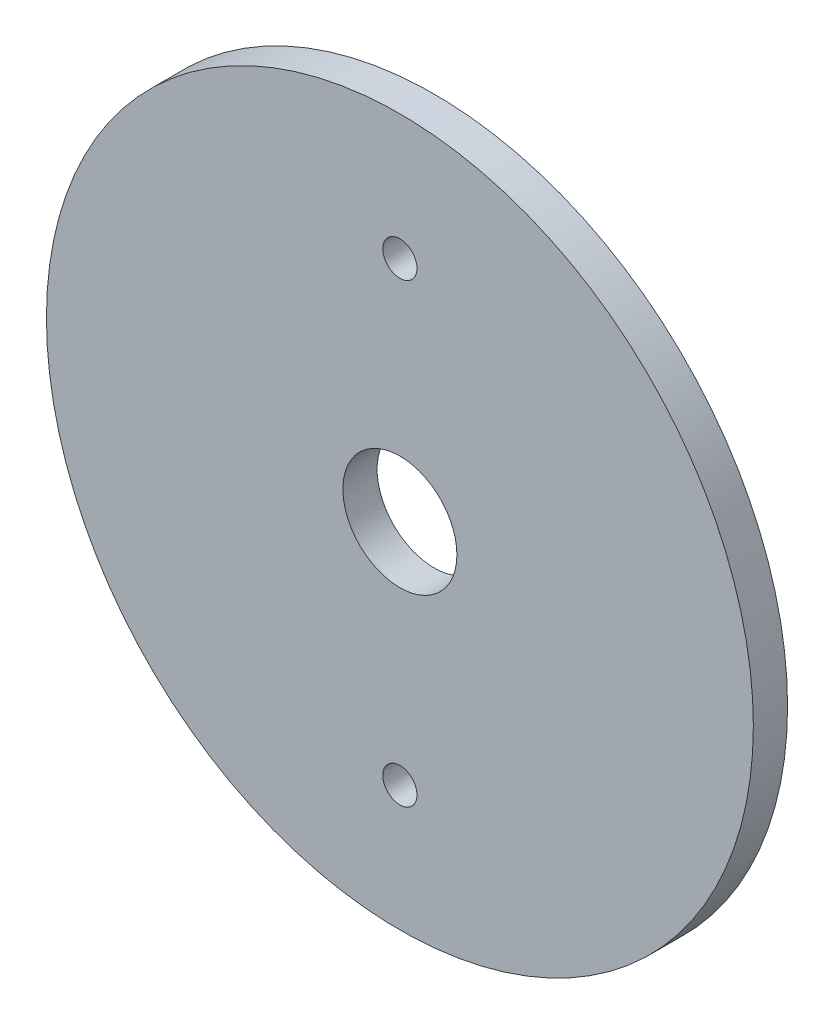
ISO-10303-21;
HEADER;
FILE_DESCRIPTION(('STEP AP214'),'2;1');
FILE_NAME('part.step','',(''),(''),'','','');
FILE_SCHEMA(('AUTOMOTIVE_DESIGN { 1 0 10303 214 1 1 1 1 }'));
ENDSEC;
DATA;
#1=APPLICATION_CONTEXT('core data for automotive mechanical design processes');
#2=APPLICATION_PROTOCOL_DEFINITION('international standard','automotive_design',2000,#1);
#3=PRODUCT_CONTEXT('',#1,'mechanical');
#4=PRODUCT('Part','Part','',(#3));
#5=PRODUCT_RELATED_PRODUCT_CATEGORY('part','',(#4));
#6=PRODUCT_DEFINITION_FORMATION('','',#4);
#7=PRODUCT_DEFINITION_CONTEXT('part definition',#1,'design');
#8=PRODUCT_DEFINITION('design','',#6,#7);
#9=PRODUCT_DEFINITION_SHAPE('','',#8);
#10=(LENGTH_UNIT() NAMED_UNIT(*) SI_UNIT(.MILLI.,.METRE.));
#11=(NAMED_UNIT(*) PLANE_ANGLE_UNIT() SI_UNIT($,.RADIAN.));
#12=(NAMED_UNIT(*) SI_UNIT($,.STERADIAN.) SOLID_ANGLE_UNIT());
#13=UNCERTAINTY_MEASURE_WITH_UNIT(LENGTH_MEASURE(1.E-05),#10,'distance_accuracy_value','');
#14=(GEOMETRIC_REPRESENTATION_CONTEXT(3) GLOBAL_UNCERTAINTY_ASSIGNED_CONTEXT((#13)) GLOBAL_UNIT_ASSIGNED_CONTEXT((#10,
#11,#12)) REPRESENTATION_CONTEXT('',''));
#15=CARTESIAN_POINT('',(0.,0.,0.));
#16=DIRECTION('',(0.,0.,1.));
#17=DIRECTION('',(1.,0.,0.));
#18=AXIS2_PLACEMENT_3D('',#15,#16,#17);
#19=CARTESIAN_POINT('',(0.,0.,0.));
#20=DIRECTION('',(0.,0.,1.));
#21=DIRECTION('',(1.,0.,0.));
#22=AXIS2_PLACEMENT_3D('',#19,#20,#21);
#23=PLANE('',#22);
#24=CARTESIAN_POINT('',(0.,20.,0.));
#25=DIRECTION('',(0.,0.,-1.));
#26=DIRECTION('',(1.,0.,0.));
#27=AXIS2_PLACEMENT_3D('',#24,#25,#26);
#28=CIRCLE('',#27,1.5);
#29=CARTESIAN_POINT('',(1.5,20.,0.));
#30=VERTEX_POINT('',#29);
#31=EDGE_CURVE('E32',#30,#30,#28,.T.);
#32=ORIENTED_EDGE('',*,*,#31,.F.);
#33=EDGE_LOOP('',(#32));
#34=FACE_BOUND('',#33,.T.);
#35=CARTESIAN_POINT('',(0.,-20.,0.));
#36=DIRECTION('',(0.,0.,-1.));
#37=DIRECTION('',(1.,0.,0.));
#38=AXIS2_PLACEMENT_3D('',#35,#36,#37);
#39=CIRCLE('',#38,1.5);
#40=CARTESIAN_POINT('',(1.5,-20.,0.));
#41=VERTEX_POINT('',#40);
#42=EDGE_CURVE('E46',#41,#41,#39,.T.);
#43=ORIENTED_EDGE('',*,*,#42,.F.);
#44=EDGE_LOOP('',(#43));
#45=FACE_BOUND('',#44,.T.);
#46=CARTESIAN_POINT('',(0.,0.,0.));
#47=DIRECTION('',(0.,0.,-1.));
#48=DIRECTION('',(1.,0.,0.));
#49=AXIS2_PLACEMENT_3D('',#46,#47,#48);
#50=CIRCLE('',#49,5.);
#51=CARTESIAN_POINT('',(5.,0.,0.));
#52=VERTEX_POINT('',#51);
#53=EDGE_CURVE('E37',#52,#52,#50,.T.);
#54=ORIENTED_EDGE('',*,*,#53,.F.);
#55=EDGE_LOOP('',(#54));
#56=FACE_BOUND('',#55,.T.);
#57=CARTESIAN_POINT('',(0.,0.,0.));
#58=DIRECTION('',(0.,0.,-1.));
#59=DIRECTION('',(1.,0.,0.));
#60=AXIS2_PLACEMENT_3D('',#57,#58,#59);
#61=CIRCLE('',#60,31.);
#62=CARTESIAN_POINT('',(31.,0.,0.));
#63=VERTEX_POINT('',#62);
#64=EDGE_CURVE('E10',#63,#63,#61,.T.);
#65=ORIENTED_EDGE('',*,*,#64,.T.);
#66=EDGE_LOOP('',(#65));
#67=FACE_BOUND('',#66,.T.);
#68=ADVANCED_FACE('F15',(#34,#45,#56,#67),#23,.F.);
#69=CARTESIAN_POINT('',(0.,0.,3.));
#70=DIRECTION('',(0.,0.,1.));
#71=DIRECTION('',(1.,0.,0.));
#72=AXIS2_PLACEMENT_3D('',#69,#70,#71);
#73=PLANE('',#72);
#74=CARTESIAN_POINT('',(0.,20.,3.));
#75=DIRECTION('',(0.,0.,-1.));
#76=DIRECTION('',(1.,0.,0.));
#77=AXIS2_PLACEMENT_3D('',#74,#75,#76);
#78=CIRCLE('',#77,1.5);
#79=CARTESIAN_POINT('',(1.5,20.,3.));
#80=VERTEX_POINT('',#79);
#81=EDGE_CURVE('E45',#80,#80,#78,.T.);
#82=ORIENTED_EDGE('',*,*,#81,.T.);
#83=EDGE_LOOP('',(#82));
#84=FACE_BOUND('',#83,.T.);
#85=CARTESIAN_POINT('',(0.,-20.,3.));
#86=DIRECTION('',(0.,0.,-1.));
#87=DIRECTION('',(1.,0.,0.));
#88=AXIS2_PLACEMENT_3D('',#85,#86,#87);
#89=CIRCLE('',#88,1.5);
#90=CARTESIAN_POINT('',(1.5,-20.,3.));
#91=VERTEX_POINT('',#90);
#92=EDGE_CURVE('E41',#91,#91,#89,.T.);
#93=ORIENTED_EDGE('',*,*,#92,.T.);
#94=EDGE_LOOP('',(#93));
#95=FACE_BOUND('',#94,.T.);
#96=CARTESIAN_POINT('',(0.,0.,3.));
#97=DIRECTION('',(0.,0.,-1.));
#98=DIRECTION('',(1.,0.,0.));
#99=AXIS2_PLACEMENT_3D('',#96,#97,#98);
#100=CIRCLE('',#99,5.);
#101=CARTESIAN_POINT('',(5.,0.,3.));
#102=VERTEX_POINT('',#101);
#103=EDGE_CURVE('E35',#102,#102,#100,.T.);
#104=ORIENTED_EDGE('',*,*,#103,.T.);
#105=EDGE_LOOP('',(#104));
#106=FACE_BOUND('',#105,.T.);
#107=CARTESIAN_POINT('',(0.,0.,3.));
#108=DIRECTION('',(0.,0.,-1.));
#109=DIRECTION('',(1.,0.,0.));
#110=AXIS2_PLACEMENT_3D('',#107,#108,#109);
#111=CIRCLE('',#110,31.);
#112=CARTESIAN_POINT('',(31.,0.,3.));
#113=VERTEX_POINT('',#112);
#114=EDGE_CURVE('E18',#113,#113,#111,.T.);
#115=ORIENTED_EDGE('',*,*,#114,.F.);
#116=EDGE_LOOP('',(#115));
#117=FACE_BOUND('',#116,.T.);
#118=ADVANCED_FACE('F55',(#84,#95,#106,#117),#73,.T.);
#119=CARTESIAN_POINT('',(0.,0.,3.));
#120=DIRECTION('',(0.,0.,-1.));
#121=DIRECTION('',(-1.,0.,0.));
#122=AXIS2_PLACEMENT_3D('',#119,#120,#121);
#123=CYLINDRICAL_SURFACE('',#122,31.);
#124=ORIENTED_EDGE('',*,*,#64,.F.);
#125=EDGE_LOOP('',(#124));
#126=FACE_BOUND('',#125,.T.);
#127=ORIENTED_EDGE('',*,*,#114,.T.);
#128=EDGE_LOOP('',(#127));
#129=FACE_BOUND('',#128,.T.);
#130=ADVANCED_FACE('F61',(#126,#129),#123,.T.);
#131=CARTESIAN_POINT('',(0.,20.,3.));
#132=DIRECTION('',(0.,0.,-1.));
#133=DIRECTION('',(-1.,0.,0.));
#134=AXIS2_PLACEMENT_3D('',#131,#132,#133);
#135=CYLINDRICAL_SURFACE('',#134,1.5);
#136=ORIENTED_EDGE('',*,*,#31,.T.);
#137=EDGE_LOOP('',(#136));
#138=FACE_BOUND('',#137,.T.);
#139=ORIENTED_EDGE('',*,*,#81,.F.);
#140=EDGE_LOOP('',(#139));
#141=FACE_BOUND('',#140,.T.);
#142=ADVANCED_FACE('F58',(#138,#141),#135,.F.);
#143=CARTESIAN_POINT('',(0.,-20.,3.));
#144=DIRECTION('',(0.,0.,-1.));
#145=DIRECTION('',(-1.,0.,0.));
#146=AXIS2_PLACEMENT_3D('',#143,#144,#145);
#147=CYLINDRICAL_SURFACE('',#146,1.5);
#148=ORIENTED_EDGE('',*,*,#42,.T.);
#149=EDGE_LOOP('',(#148));
#150=FACE_BOUND('',#149,.T.);
#151=ORIENTED_EDGE('',*,*,#92,.F.);
#152=EDGE_LOOP('',(#151));
#153=FACE_BOUND('',#152,.T.);
#154=ADVANCED_FACE('F60',(#150,#153),#147,.F.);
#155=CARTESIAN_POINT('',(0.,0.,3.));
#156=DIRECTION('',(0.,0.,-1.));
#157=DIRECTION('',(-1.,0.,0.));
#158=AXIS2_PLACEMENT_3D('',#155,#156,#157);
#159=CYLINDRICAL_SURFACE('',#158,5.);
#160=ORIENTED_EDGE('',*,*,#53,.T.);
#161=EDGE_LOOP('',(#160));
#162=FACE_BOUND('',#161,.T.);
#163=ORIENTED_EDGE('',*,*,#103,.F.);
#164=EDGE_LOOP('',(#163));
#165=FACE_BOUND('',#164,.T.);
#166=ADVANCED_FACE('F69',(#162,#165),#159,.F.);
#167=CLOSED_SHELL('',(#68,#118,#130,#142,#154,#166));
#168=MANIFOLD_SOLID_BREP('B1',#167);
#169=ADVANCED_BREP_SHAPE_REPRESENTATION('',(#18,#168),#14);
#170=SHAPE_DEFINITION_REPRESENTATION(#9,#169);
ENDSEC;
END-ISO-10303-21;
